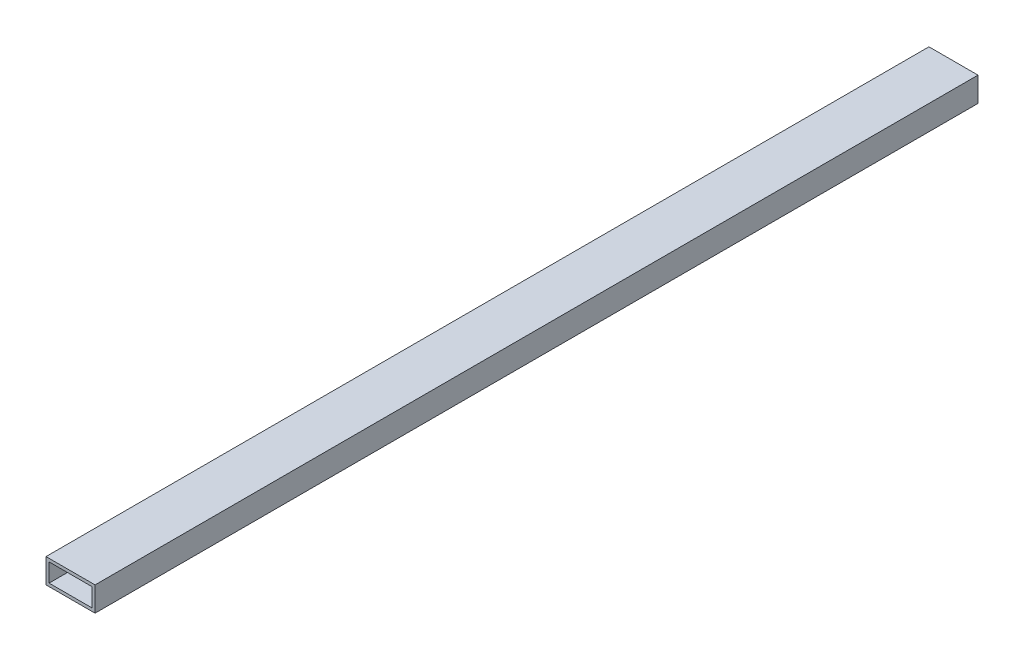
ISO-10303-21;
HEADER;
FILE_DESCRIPTION(('STEP AP214'),'2;1');
FILE_NAME('part.step','',(''),(''),'','','');
FILE_SCHEMA(('AUTOMOTIVE_DESIGN { 1 0 10303 214 1 1 1 1 }'));
ENDSEC;
DATA;
#1=APPLICATION_CONTEXT('core data for automotive mechanical design processes');
#2=APPLICATION_PROTOCOL_DEFINITION('international standard','automotive_design',2000,#1);
#3=PRODUCT_CONTEXT('',#1,'mechanical');
#4=PRODUCT('Part','Part','',(#3));
#5=PRODUCT_RELATED_PRODUCT_CATEGORY('part','',(#4));
#6=PRODUCT_DEFINITION_FORMATION('','',#4);
#7=PRODUCT_DEFINITION_CONTEXT('part definition',#1,'design');
#8=PRODUCT_DEFINITION('design','',#6,#7);
#9=PRODUCT_DEFINITION_SHAPE('','',#8);
#10=(LENGTH_UNIT() NAMED_UNIT(*) SI_UNIT(.MILLI.,.METRE.));
#11=(NAMED_UNIT(*) PLANE_ANGLE_UNIT() SI_UNIT($,.RADIAN.));
#12=(NAMED_UNIT(*) SI_UNIT($,.STERADIAN.) SOLID_ANGLE_UNIT());
#13=UNCERTAINTY_MEASURE_WITH_UNIT(LENGTH_MEASURE(1.E-05),#10,'distance_accuracy_value','');
#14=(GEOMETRIC_REPRESENTATION_CONTEXT(3) GLOBAL_UNCERTAINTY_ASSIGNED_CONTEXT((#13)) GLOBAL_UNIT_ASSIGNED_CONTEXT((#10,
#11,#12)) REPRESENTATION_CONTEXT('',''));
#15=CARTESIAN_POINT('',(0.,0.,0.));
#16=DIRECTION('',(0.,0.,1.));
#17=DIRECTION('',(1.,0.,0.));
#18=AXIS2_PLACEMENT_3D('',#15,#16,#17);
#19=CARTESIAN_POINT('',(25.4,12.7,914.4));
#20=DIRECTION('',(-1.,0.,0.));
#21=DIRECTION('',(0.,0.,1.));
#22=AXIS2_PLACEMENT_3D('',#19,#20,#21);
#23=PLANE('',#22);
#24=DIRECTION('',(0.,1.,0.));
#25=VECTOR('',#24,1.);
#26=CARTESIAN_POINT('',(25.4,12.7,0.));
#27=LINE('',#26,#25);
#28=CARTESIAN_POINT('',(25.4,-12.7,0.));
#29=VERTEX_POINT('',#28);
#30=CARTESIAN_POINT('',(25.4,12.7,0.));
#31=VERTEX_POINT('',#30);
#32=EDGE_CURVE('E145',#29,#31,#27,.T.);
#33=ORIENTED_EDGE('',*,*,#32,.T.);
#34=DIRECTION('',(0.,0.,-1.));
#35=VECTOR('',#34,1.);
#36=CARTESIAN_POINT('',(25.4,12.7,914.4));
#37=LINE('',#36,#35);
#38=CARTESIAN_POINT('',(25.4,12.7,914.4));
#39=VERTEX_POINT('',#38);
#40=EDGE_CURVE('E11',#39,#31,#37,.T.);
#41=ORIENTED_EDGE('',*,*,#40,.F.);
#42=DIRECTION('',(0.,1.,0.));
#43=VECTOR('',#42,1.);
#44=CARTESIAN_POINT('',(25.4,12.7,914.4));
#45=LINE('',#44,#43);
#46=CARTESIAN_POINT('',(25.4,-12.7,914.4));
#47=VERTEX_POINT('',#46);
#48=EDGE_CURVE('E134',#47,#39,#45,.T.);
#49=ORIENTED_EDGE('',*,*,#48,.F.);
#50=DIRECTION('',(0.,0.,-1.));
#51=VECTOR('',#50,1.);
#52=CARTESIAN_POINT('',(25.4,-12.7,914.4));
#53=LINE('',#52,#51);
#54=EDGE_CURVE('E144',#47,#29,#53,.T.);
#55=ORIENTED_EDGE('',*,*,#54,.T.);
#56=EDGE_LOOP('',(#33,#41,#49,#55));
#57=FACE_BOUND('',#56,.T.);
#58=ADVANCED_FACE('F37',(#57),#23,.F.);
#59=CARTESIAN_POINT('',(-25.4,12.7,914.4));
#60=DIRECTION('',(0.,-1.,0.));
#61=DIRECTION('',(0.,0.,-1.));
#62=AXIS2_PLACEMENT_3D('',#59,#60,#61);
#63=PLANE('',#62);
#64=DIRECTION('',(-1.,0.,0.));
#65=VECTOR('',#64,1.);
#66=CARTESIAN_POINT('',(-25.4,12.7,0.));
#67=LINE('',#66,#65);
#68=CARTESIAN_POINT('',(-25.4,12.7,0.));
#69=VERTEX_POINT('',#68);
#70=EDGE_CURVE('E148',#31,#69,#67,.T.);
#71=ORIENTED_EDGE('',*,*,#70,.T.);
#72=DIRECTION('',(0.,0.,-1.));
#73=VECTOR('',#72,1.);
#74=CARTESIAN_POINT('',(-25.4,12.7,914.4));
#75=LINE('',#74,#73);
#76=CARTESIAN_POINT('',(-25.4,12.7,914.4));
#77=VERTEX_POINT('',#76);
#78=EDGE_CURVE('E44',#77,#69,#75,.T.);
#79=ORIENTED_EDGE('',*,*,#78,.F.);
#80=DIRECTION('',(-1.,0.,0.));
#81=VECTOR('',#80,1.);
#82=CARTESIAN_POINT('',(-25.4,12.7,914.4));
#83=LINE('',#82,#81);
#84=EDGE_CURVE('E137',#39,#77,#83,.T.);
#85=ORIENTED_EDGE('',*,*,#84,.F.);
#86=ORIENTED_EDGE('',*,*,#40,.T.);
#87=EDGE_LOOP('',(#71,#79,#85,#86));
#88=FACE_BOUND('',#87,.T.);
#89=ADVANCED_FACE('F176',(#88),#63,.F.);
#90=CARTESIAN_POINT('',(-25.4,12.7,914.4));
#91=DIRECTION('',(1.,0.,0.));
#92=DIRECTION('',(0.,0.,-1.));
#93=AXIS2_PLACEMENT_3D('',#90,#91,#92);
#94=PLANE('',#93);
#95=DIRECTION('',(0.,-1.,0.));
#96=VECTOR('',#95,1.);
#97=CARTESIAN_POINT('',(-25.4,12.7,0.));
#98=LINE('',#97,#96);
#99=CARTESIAN_POINT('',(-25.4,-12.7,0.));
#100=VERTEX_POINT('',#99);
#101=EDGE_CURVE('E150',#69,#100,#98,.T.);
#102=ORIENTED_EDGE('',*,*,#101,.T.);
#103=DIRECTION('',(0.,0.,-1.));
#104=VECTOR('',#103,1.);
#105=CARTESIAN_POINT('',(-25.4,-12.7,914.4));
#106=LINE('',#105,#104);
#107=CARTESIAN_POINT('',(-25.4,-12.7,914.4));
#108=VERTEX_POINT('',#107);
#109=EDGE_CURVE('E155',#108,#100,#106,.T.);
#110=ORIENTED_EDGE('',*,*,#109,.F.);
#111=DIRECTION('',(0.,-1.,0.));
#112=VECTOR('',#111,1.);
#113=CARTESIAN_POINT('',(-25.4,12.7,914.4));
#114=LINE('',#113,#112);
#115=EDGE_CURVE('E140',#77,#108,#114,.T.);
#116=ORIENTED_EDGE('',*,*,#115,.F.);
#117=ORIENTED_EDGE('',*,*,#78,.T.);
#118=EDGE_LOOP('',(#102,#110,#116,#117));
#119=FACE_BOUND('',#118,.T.);
#120=ADVANCED_FACE('F162',(#119),#94,.F.);
#121=CARTESIAN_POINT('',(-25.4,-12.7,914.4));
#122=DIRECTION('',(0.,1.,0.));
#123=DIRECTION('',(0.,0.,1.));
#124=AXIS2_PLACEMENT_3D('',#121,#122,#123);
#125=PLANE('',#124);
#126=DIRECTION('',(1.,0.,0.));
#127=VECTOR('',#126,1.);
#128=CARTESIAN_POINT('',(-25.4,-12.7,0.));
#129=LINE('',#128,#127);
#130=EDGE_CURVE('E138',#100,#29,#129,.T.);
#131=ORIENTED_EDGE('',*,*,#130,.T.);
#132=ORIENTED_EDGE('',*,*,#54,.F.);
#133=DIRECTION('',(1.,0.,0.));
#134=VECTOR('',#133,1.);
#135=CARTESIAN_POINT('',(-25.4,-12.7,914.4));
#136=LINE('',#135,#134);
#137=EDGE_CURVE('E142',#108,#47,#136,.T.);
#138=ORIENTED_EDGE('',*,*,#137,.F.);
#139=ORIENTED_EDGE('',*,*,#109,.T.);
#140=EDGE_LOOP('',(#131,#132,#138,#139));
#141=FACE_BOUND('',#140,.T.);
#142=ADVANCED_FACE('F169',(#141),#125,.F.);
#143=CARTESIAN_POINT('',(0.,0.,914.4));
#144=DIRECTION('',(0.,0.,1.));
#145=DIRECTION('',(1.,0.,0.));
#146=AXIS2_PLACEMENT_3D('',#143,#144,#145);
#147=PLANE('',#146);
#148=DIRECTION('',(0.,1.,0.));
#149=VECTOR('',#148,1.);
#150=CARTESIAN_POINT('',(22.225,12.7,914.4));
#151=LINE('',#150,#149);
#152=CARTESIAN_POINT('',(22.225,-9.525,914.4));
#153=VERTEX_POINT('',#152);
#154=CARTESIAN_POINT('',(22.225,9.525,914.4));
#155=VERTEX_POINT('',#154);
#156=EDGE_CURVE('E122',#153,#155,#151,.T.);
#157=ORIENTED_EDGE('',*,*,#156,.F.);
#158=DIRECTION('',(1.,0.,0.));
#159=VECTOR('',#158,1.);
#160=CARTESIAN_POINT('',(-25.4,-9.525,914.4));
#161=LINE('',#160,#159);
#162=CARTESIAN_POINT('',(-22.225,-9.525,914.4));
#163=VERTEX_POINT('',#162);
#164=EDGE_CURVE('E106',#163,#153,#161,.T.);
#165=ORIENTED_EDGE('',*,*,#164,.F.);
#166=DIRECTION('',(0.,-1.,0.));
#167=VECTOR('',#166,1.);
#168=CARTESIAN_POINT('',(-22.225,12.7,914.4));
#169=LINE('',#168,#167);
#170=CARTESIAN_POINT('',(-22.225,9.525,914.4));
#171=VERTEX_POINT('',#170);
#172=EDGE_CURVE('E131',#171,#163,#169,.T.);
#173=ORIENTED_EDGE('',*,*,#172,.F.);
#174=DIRECTION('',(-1.,0.,0.));
#175=VECTOR('',#174,1.);
#176=CARTESIAN_POINT('',(-25.4,9.525,914.4));
#177=LINE('',#176,#175);
#178=EDGE_CURVE('E124',#155,#171,#177,.T.);
#179=ORIENTED_EDGE('',*,*,#178,.F.);
#180=EDGE_LOOP('',(#157,#165,#173,#179));
#181=FACE_BOUND('',#180,.T.);
#182=ORIENTED_EDGE('',*,*,#48,.T.);
#183=ORIENTED_EDGE('',*,*,#84,.T.);
#184=ORIENTED_EDGE('',*,*,#115,.T.);
#185=ORIENTED_EDGE('',*,*,#137,.T.);
#186=EDGE_LOOP('',(#182,#183,#184,#185));
#187=FACE_BOUND('',#186,.T.);
#188=ADVANCED_FACE('F175',(#181,#187),#147,.T.);
#189=CARTESIAN_POINT('',(0.,0.,0.));
#190=DIRECTION('',(0.,0.,1.));
#191=DIRECTION('',(1.,0.,0.));
#192=AXIS2_PLACEMENT_3D('',#189,#190,#191);
#193=PLANE('',#192);
#194=DIRECTION('',(1.,0.,0.));
#195=VECTOR('',#194,1.);
#196=CARTESIAN_POINT('',(-25.4,-9.525,0.));
#197=LINE('',#196,#195);
#198=CARTESIAN_POINT('',(-22.225,-9.525,0.));
#199=VERTEX_POINT('',#198);
#200=CARTESIAN_POINT('',(22.225,-9.525,0.));
#201=VERTEX_POINT('',#200);
#202=EDGE_CURVE('E104',#199,#201,#197,.T.);
#203=ORIENTED_EDGE('',*,*,#202,.T.);
#204=DIRECTION('',(0.,1.,0.));
#205=VECTOR('',#204,1.);
#206=CARTESIAN_POINT('',(22.225,12.7,0.));
#207=LINE('',#206,#205);
#208=CARTESIAN_POINT('',(22.225,9.525,0.));
#209=VERTEX_POINT('',#208);
#210=EDGE_CURVE('E112',#201,#209,#207,.T.);
#211=ORIENTED_EDGE('',*,*,#210,.T.);
#212=DIRECTION('',(-1.,0.,0.));
#213=VECTOR('',#212,1.);
#214=CARTESIAN_POINT('',(-25.4,9.525,0.));
#215=LINE('',#214,#213);
#216=CARTESIAN_POINT('',(-22.225,9.525,0.));
#217=VERTEX_POINT('',#216);
#218=EDGE_CURVE('E118',#209,#217,#215,.T.);
#219=ORIENTED_EDGE('',*,*,#218,.T.);
#220=DIRECTION('',(0.,-1.,0.));
#221=VECTOR('',#220,1.);
#222=CARTESIAN_POINT('',(-22.225,12.7,0.));
#223=LINE('',#222,#221);
#224=EDGE_CURVE('E58',#217,#199,#223,.T.);
#225=ORIENTED_EDGE('',*,*,#224,.T.);
#226=EDGE_LOOP('',(#203,#211,#219,#225));
#227=FACE_BOUND('',#226,.T.);
#228=ORIENTED_EDGE('',*,*,#32,.F.);
#229=ORIENTED_EDGE('',*,*,#130,.F.);
#230=ORIENTED_EDGE('',*,*,#101,.F.);
#231=ORIENTED_EDGE('',*,*,#70,.F.);
#232=EDGE_LOOP('',(#228,#229,#230,#231));
#233=FACE_BOUND('',#232,.T.);
#234=ADVANCED_FACE('F120',(#227,#233),#193,.F.);
#235=CARTESIAN_POINT('',(22.225,12.7,914.4));
#236=DIRECTION('',(-1.,0.,0.));
#237=DIRECTION('',(0.,0.,1.));
#238=AXIS2_PLACEMENT_3D('',#235,#236,#237);
#239=PLANE('',#238);
#240=ORIENTED_EDGE('',*,*,#210,.F.);
#241=DIRECTION('',(0.,0.,-1.));
#242=VECTOR('',#241,1.);
#243=CARTESIAN_POINT('',(22.225,-9.525,914.4));
#244=LINE('',#243,#242);
#245=EDGE_CURVE('E100',#153,#201,#244,.T.);
#246=ORIENTED_EDGE('',*,*,#245,.F.);
#247=ORIENTED_EDGE('',*,*,#156,.T.);
#248=DIRECTION('',(0.,0.,-1.));
#249=VECTOR('',#248,1.);
#250=CARTESIAN_POINT('',(22.225,9.525,914.4));
#251=LINE('',#250,#249);
#252=EDGE_CURVE('E115',#155,#209,#251,.T.);
#253=ORIENTED_EDGE('',*,*,#252,.T.);
#254=EDGE_LOOP('',(#240,#246,#247,#253));
#255=FACE_BOUND('',#254,.T.);
#256=ADVANCED_FACE('F113',(#255),#239,.T.);
#257=CARTESIAN_POINT('',(-25.4,9.525,914.4));
#258=DIRECTION('',(0.,-1.,0.));
#259=DIRECTION('',(0.,0.,-1.));
#260=AXIS2_PLACEMENT_3D('',#257,#258,#259);
#261=PLANE('',#260);
#262=ORIENTED_EDGE('',*,*,#218,.F.);
#263=ORIENTED_EDGE('',*,*,#252,.F.);
#264=ORIENTED_EDGE('',*,*,#178,.T.);
#265=DIRECTION('',(0.,0.,-1.));
#266=VECTOR('',#265,1.);
#267=CARTESIAN_POINT('',(-22.225,9.525,914.4));
#268=LINE('',#267,#266);
#269=EDGE_CURVE('E280',#171,#217,#268,.T.);
#270=ORIENTED_EDGE('',*,*,#269,.T.);
#271=EDGE_LOOP('',(#262,#263,#264,#270));
#272=FACE_BOUND('',#271,.T.);
#273=ADVANCED_FACE('F196',(#272),#261,.T.);
#274=CARTESIAN_POINT('',(-22.225,12.7,914.4));
#275=DIRECTION('',(1.,0.,0.));
#276=DIRECTION('',(0.,0.,-1.));
#277=AXIS2_PLACEMENT_3D('',#274,#275,#276);
#278=PLANE('',#277);
#279=ORIENTED_EDGE('',*,*,#224,.F.);
#280=ORIENTED_EDGE('',*,*,#269,.F.);
#281=ORIENTED_EDGE('',*,*,#172,.T.);
#282=DIRECTION('',(0.,0.,-1.));
#283=VECTOR('',#282,1.);
#284=CARTESIAN_POINT('',(-22.225,-9.525,914.4));
#285=LINE('',#284,#283);
#286=EDGE_CURVE('E51',#163,#199,#285,.T.);
#287=ORIENTED_EDGE('',*,*,#286,.T.);
#288=EDGE_LOOP('',(#279,#280,#281,#287));
#289=FACE_BOUND('',#288,.T.);
#290=ADVANCED_FACE('F193',(#289),#278,.T.);
#291=CARTESIAN_POINT('',(-25.4,-9.525,914.4));
#292=DIRECTION('',(0.,1.,0.));
#293=DIRECTION('',(0.,0.,1.));
#294=AXIS2_PLACEMENT_3D('',#291,#292,#293);
#295=PLANE('',#294);
#296=ORIENTED_EDGE('',*,*,#202,.F.);
#297=ORIENTED_EDGE('',*,*,#286,.F.);
#298=ORIENTED_EDGE('',*,*,#164,.T.);
#299=ORIENTED_EDGE('',*,*,#245,.T.);
#300=EDGE_LOOP('',(#296,#297,#298,#299));
#301=FACE_BOUND('',#300,.T.);
#302=ADVANCED_FACE('F102',(#301),#295,.T.);
#303=CLOSED_SHELL('',(#58,#89,#120,#142,#188,#234,#256,#273,#290,#302));
#304=MANIFOLD_SOLID_BREP('B2',#303);
#305=ADVANCED_BREP_SHAPE_REPRESENTATION('',(#18,#304),#14);
#306=SHAPE_DEFINITION_REPRESENTATION(#9,#305);
ENDSEC;
END-ISO-10303-21;
